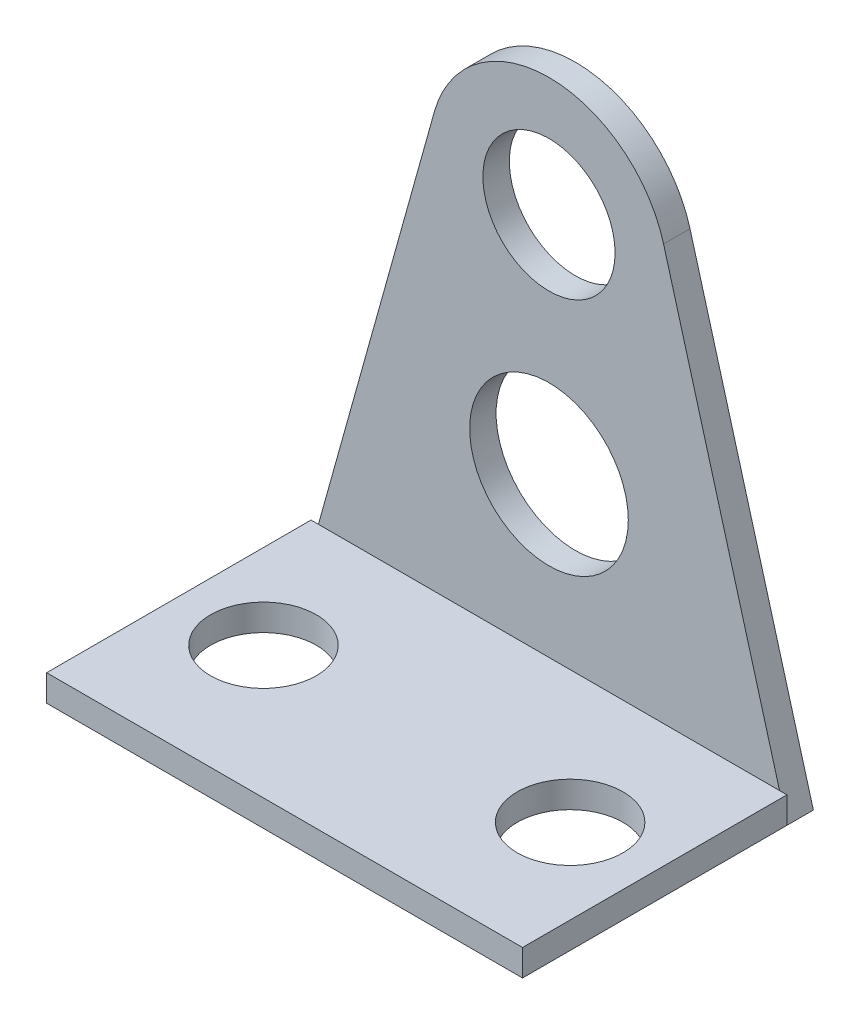
ISO-10303-21;
HEADER;
FILE_DESCRIPTION(('STEP AP214'),'2;1');
FILE_NAME('part.step','',(''),(''),'','','');
FILE_SCHEMA(('AUTOMOTIVE_DESIGN { 1 0 10303 214 1 1 1 1 }'));
ENDSEC;
DATA;
#1=APPLICATION_CONTEXT('core data for automotive mechanical design processes');
#2=APPLICATION_PROTOCOL_DEFINITION('international standard','automotive_design',2000,#1);
#3=PRODUCT_CONTEXT('',#1,'mechanical');
#4=PRODUCT('Part','Part','',(#3));
#5=PRODUCT_RELATED_PRODUCT_CATEGORY('part','',(#4));
#6=PRODUCT_DEFINITION_FORMATION('','',#4);
#7=PRODUCT_DEFINITION_CONTEXT('part definition',#1,'design');
#8=PRODUCT_DEFINITION('design','',#6,#7);
#9=PRODUCT_DEFINITION_SHAPE('','',#8);
#10=(LENGTH_UNIT() NAMED_UNIT(*) SI_UNIT(.MILLI.,.METRE.));
#11=(NAMED_UNIT(*) PLANE_ANGLE_UNIT() SI_UNIT($,.RADIAN.));
#12=(NAMED_UNIT(*) SI_UNIT($,.STERADIAN.) SOLID_ANGLE_UNIT());
#13=UNCERTAINTY_MEASURE_WITH_UNIT(LENGTH_MEASURE(1.E-05),#10,'distance_accuracy_value','');
#14=(GEOMETRIC_REPRESENTATION_CONTEXT(3) GLOBAL_UNCERTAINTY_ASSIGNED_CONTEXT((#13)) GLOBAL_UNIT_ASSIGNED_CONTEXT((#10,
#11,#12)) REPRESENTATION_CONTEXT('',''));
#15=CARTESIAN_POINT('',(0.,0.,0.));
#16=DIRECTION('',(0.,0.,1.));
#17=DIRECTION('',(1.,0.,0.));
#18=AXIS2_PLACEMENT_3D('',#15,#16,#17);
#19=CARTESIAN_POINT('',(4.5,7.75,0.5));
#20=DIRECTION('',(0.,0.,1.));
#21=DIRECTION('',(1.,0.,0.));
#22=AXIS2_PLACEMENT_3D('',#19,#20,#21);
#23=PLANE('',#22);
#24=DIRECTION('',(-1.,0.,0.));
#25=VECTOR('',#24,1.);
#26=CARTESIAN_POINT('',(0.,0.5,0.5));
#27=LINE('',#26,#25);
#28=CARTESIAN_POINT('',(8.86039109563191,0.5,0.5));
#29=VERTEX_POINT('',#28);
#30=CARTESIAN_POINT('',(0.139608904368094,0.5,0.5));
#31=VERTEX_POINT('',#30);
#32=EDGE_CURVE('E11',#29,#31,#27,.T.);
#33=ORIENTED_EDGE('',*,*,#32,.F.);
#34=DIRECTION('',(-0.268931250291291,0.963159375501668,0.));
#35=VECTOR('',#34,1.);
#36=CARTESIAN_POINT('',(9.,0.,0.5));
#37=LINE('',#36,#35);
#38=CARTESIAN_POINT('',(6.66710859487875,8.3550953131554,0.5));
#39=VERTEX_POINT('',#38);
#40=EDGE_CURVE('E155',#29,#39,#37,.T.);
#41=ORIENTED_EDGE('',*,*,#40,.T.);
#42=CARTESIAN_POINT('',(4.5,7.75,0.5));
#43=DIRECTION('',(0.,0.,1.));
#44=DIRECTION('',(1.,0.,0.));
#45=AXIS2_PLACEMENT_3D('',#42,#43,#44);
#46=CIRCLE('',#45,2.25);
#47=CARTESIAN_POINT('',(2.33289140512125,8.3550953131554,0.5));
#48=VERTEX_POINT('',#47);
#49=EDGE_CURVE('E58',#39,#48,#46,.T.);
#50=ORIENTED_EDGE('',*,*,#49,.T.);
#51=DIRECTION('',(-0.268931250291291,-0.963159375501668,0.));
#52=VECTOR('',#51,1.);
#53=CARTESIAN_POINT('',(0.,0.,0.5));
#54=LINE('',#53,#52);
#55=EDGE_CURVE('E153',#48,#31,#54,.T.);
#56=ORIENTED_EDGE('',*,*,#55,.T.);
#57=EDGE_LOOP('',(#33,#41,#50,#56));
#58=FACE_BOUND('',#57,.T.);
#59=CARTESIAN_POINT('',(4.5,7.75,0.5));
#60=DIRECTION('',(0.,0.,1.));
#61=DIRECTION('',(1.,0.,0.));
#62=AXIS2_PLACEMENT_3D('',#59,#60,#61);
#63=CIRCLE('',#62,1.25);
#64=CARTESIAN_POINT('',(5.75,7.75,0.5));
#65=VERTEX_POINT('',#64);
#66=EDGE_CURVE('E147',#65,#65,#63,.T.);
#67=ORIENTED_EDGE('',*,*,#66,.F.);
#68=EDGE_LOOP('',(#67));
#69=FACE_BOUND('',#68,.T.);
#70=CARTESIAN_POINT('',(4.5,3.5,0.5));
#71=DIRECTION('',(0.,0.,1.));
#72=DIRECTION('',(1.,0.,0.));
#73=AXIS2_PLACEMENT_3D('',#70,#71,#72);
#74=CIRCLE('',#73,1.5);
#75=CARTESIAN_POINT('',(6.,3.5,0.5));
#76=VERTEX_POINT('',#75);
#77=EDGE_CURVE('E138',#76,#76,#74,.T.);
#78=ORIENTED_EDGE('',*,*,#77,.F.);
#79=EDGE_LOOP('',(#78));
#80=FACE_BOUND('',#79,.T.);
#81=ADVANCED_FACE('F36',(#58,#69,#80),#23,.T.);
#82=CARTESIAN_POINT('',(4.5,7.75,0.));
#83=DIRECTION('',(0.,0.,1.));
#84=DIRECTION('',(1.,0.,0.));
#85=AXIS2_PLACEMENT_3D('',#82,#83,#84);
#86=PLANE('',#85);
#87=CARTESIAN_POINT('',(4.5,7.75,0.));
#88=DIRECTION('',(0.,0.,1.));
#89=DIRECTION('',(1.,0.,0.));
#90=AXIS2_PLACEMENT_3D('',#87,#88,#89);
#91=CIRCLE('',#90,1.25);
#92=CARTESIAN_POINT('',(5.75,7.75,0.));
#93=VERTEX_POINT('',#92);
#94=EDGE_CURVE('E145',#93,#93,#91,.T.);
#95=ORIENTED_EDGE('',*,*,#94,.T.);
#96=EDGE_LOOP('',(#95));
#97=FACE_BOUND('',#96,.T.);
#98=DIRECTION('',(-0.268931250291291,-0.963159375501668,0.));
#99=VECTOR('',#98,1.);
#100=CARTESIAN_POINT('',(0.,0.,0.));
#101=LINE('',#100,#99);
#102=CARTESIAN_POINT('',(2.33289140512125,8.3550953131554,0.));
#103=VERTEX_POINT('',#102);
#104=CARTESIAN_POINT('',(0.,0.,0.));
#105=VERTEX_POINT('',#104);
#106=EDGE_CURVE('E150',#103,#105,#101,.T.);
#107=ORIENTED_EDGE('',*,*,#106,.F.);
#108=CARTESIAN_POINT('',(4.5,7.75,0.));
#109=DIRECTION('',(0.,0.,1.));
#110=DIRECTION('',(1.,0.,0.));
#111=AXIS2_PLACEMENT_3D('',#108,#109,#110);
#112=CIRCLE('',#111,2.25);
#113=CARTESIAN_POINT('',(6.66710859487875,8.3550953131554,0.));
#114=VERTEX_POINT('',#113);
#115=EDGE_CURVE('E79',#114,#103,#112,.T.);
#116=ORIENTED_EDGE('',*,*,#115,.F.);
#117=DIRECTION('',(-0.268931250291291,0.963159375501668,0.));
#118=VECTOR('',#117,1.);
#119=CARTESIAN_POINT('',(9.,0.,0.));
#120=LINE('',#119,#118);
#121=CARTESIAN_POINT('',(9.,0.,0.));
#122=VERTEX_POINT('',#121);
#123=EDGE_CURVE('E165',#122,#114,#120,.T.);
#124=ORIENTED_EDGE('',*,*,#123,.F.);
#125=DIRECTION('',(1.,0.,0.));
#126=VECTOR('',#125,1.);
#127=CARTESIAN_POINT('',(0.,0.,0.));
#128=LINE('',#127,#126);
#129=EDGE_CURVE('E163',#105,#122,#128,.T.);
#130=ORIENTED_EDGE('',*,*,#129,.F.);
#131=EDGE_LOOP('',(#107,#116,#124,#130));
#132=FACE_BOUND('',#131,.T.);
#133=CARTESIAN_POINT('',(4.5,3.5,0.));
#134=DIRECTION('',(0.,0.,1.));
#135=DIRECTION('',(1.,0.,0.));
#136=AXIS2_PLACEMENT_3D('',#133,#134,#135);
#137=CIRCLE('',#136,1.5);
#138=CARTESIAN_POINT('',(6.,3.5,0.));
#139=VERTEX_POINT('',#138);
#140=EDGE_CURVE('E135',#139,#139,#137,.T.);
#141=ORIENTED_EDGE('',*,*,#140,.T.);
#142=EDGE_LOOP('',(#141));
#143=FACE_BOUND('',#142,.T.);
#144=ADVANCED_FACE('F178',(#97,#132,#143),#86,.F.);
#145=CARTESIAN_POINT('',(0.,0.,0.5));
#146=DIRECTION('',(0.963159375501668,-0.268931250291291,0.));
#147=DIRECTION('',(0.268931250291291,0.963159375501668,0.));
#148=AXIS2_PLACEMENT_3D('',#145,#146,#147);
#149=PLANE('',#148);
#150=ORIENTED_EDGE('',*,*,#106,.T.);
#151=DIRECTION('',(0.,0.,-1.));
#152=VECTOR('',#151,1.);
#153=CARTESIAN_POINT('',(0.,0.,0.5));
#154=LINE('',#153,#152);
#155=CARTESIAN_POINT('',(0.,0.,0.5));
#156=VERTEX_POINT('',#155);
#157=EDGE_CURVE('E40',#156,#105,#154,.T.);
#158=ORIENTED_EDGE('',*,*,#157,.F.);
#159=EDGE_CURVE('E156',#31,#156,#54,.T.);
#160=ORIENTED_EDGE('',*,*,#159,.F.);
#161=ORIENTED_EDGE('',*,*,#55,.F.);
#162=DIRECTION('',(0.,0.,-1.));
#163=VECTOR('',#162,1.);
#164=CARTESIAN_POINT('',(2.33289140512125,8.3550953131554,0.5));
#165=LINE('',#164,#163);
#166=EDGE_CURVE('E161',#48,#103,#165,.T.);
#167=ORIENTED_EDGE('',*,*,#166,.T.);
#168=EDGE_LOOP('',(#150,#158,#160,#161,#167));
#169=FACE_BOUND('',#168,.T.);
#170=ADVANCED_FACE('F38',(#169),#149,.F.);
#171=CARTESIAN_POINT('',(0.,0.,0.5));
#172=DIRECTION('',(0.,1.,0.));
#173=DIRECTION('',(0.,0.,1.));
#174=AXIS2_PLACEMENT_3D('',#171,#172,#173);
#175=PLANE('',#174);
#176=CARTESIAN_POINT('',(7.4,0.,3.));
#177=DIRECTION('',(0.,1.,0.));
#178=DIRECTION('',(0.,0.,1.));
#179=AXIS2_PLACEMENT_3D('',#176,#177,#178);
#180=CIRCLE('',#179,1.);
#181=CARTESIAN_POINT('',(7.4,0.,4.));
#182=VERTEX_POINT('',#181);
#183=EDGE_CURVE('E216',#182,#182,#180,.F.);
#184=ORIENTED_EDGE('',*,*,#183,.F.);
#185=EDGE_LOOP('',(#184));
#186=FACE_BOUND('',#185,.T.);
#187=CARTESIAN_POINT('',(1.6,0.,3.));
#188=DIRECTION('',(0.,1.,0.));
#189=DIRECTION('',(0.,0.,1.));
#190=AXIS2_PLACEMENT_3D('',#187,#188,#189);
#191=CIRCLE('',#190,1.);
#192=CARTESIAN_POINT('',(1.6,0.,4.));
#193=VERTEX_POINT('',#192);
#194=EDGE_CURVE('E219',#193,#193,#191,.F.);
#195=ORIENTED_EDGE('',*,*,#194,.F.);
#196=EDGE_LOOP('',(#195));
#197=FACE_BOUND('',#196,.T.);
#198=ORIENTED_EDGE('',*,*,#129,.T.);
#199=DIRECTION('',(0.,0.,-1.));
#200=VECTOR('',#199,1.);
#201=CARTESIAN_POINT('',(9.,0.,0.5));
#202=LINE('',#201,#200);
#203=CARTESIAN_POINT('',(9.,0.,0.5));
#204=VERTEX_POINT('',#203);
#205=EDGE_CURVE('E170',#204,#122,#202,.T.);
#206=ORIENTED_EDGE('',*,*,#205,.F.);
#207=DIRECTION('',(0.,0.,-1.));
#208=VECTOR('',#207,1.);
#209=CARTESIAN_POINT('',(9.,0.,5.5));
#210=LINE('',#209,#208);
#211=CARTESIAN_POINT('',(9.,0.,5.5));
#212=VERTEX_POINT('',#211);
#213=EDGE_CURVE('E118',#212,#204,#210,.T.);
#214=ORIENTED_EDGE('',*,*,#213,.F.);
#215=DIRECTION('',(1.,0.,0.));
#216=VECTOR('',#215,1.);
#217=CARTESIAN_POINT('',(0.,0.,5.5));
#218=LINE('',#217,#216);
#219=CARTESIAN_POINT('',(0.,0.,5.5));
#220=VERTEX_POINT('',#219);
#221=EDGE_CURVE('E111',#220,#212,#218,.T.);
#222=ORIENTED_EDGE('',*,*,#221,.F.);
#223=DIRECTION('',(0.,0.,-1.));
#224=VECTOR('',#223,1.);
#225=CARTESIAN_POINT('',(0.,0.,5.5));
#226=LINE('',#225,#224);
#227=EDGE_CURVE('E115',#220,#156,#226,.T.);
#228=ORIENTED_EDGE('',*,*,#227,.T.);
#229=ORIENTED_EDGE('',*,*,#157,.T.);
#230=EDGE_LOOP('',(#198,#206,#214,#222,#228,#229));
#231=FACE_BOUND('',#230,.T.);
#232=ADVANCED_FACE('F113',(#186,#197,#231),#175,.F.);
#233=CARTESIAN_POINT('',(9.,0.,0.5));
#234=DIRECTION('',(-0.963159375501668,-0.268931250291291,0.));
#235=DIRECTION('',(0.268931250291291,-0.963159375501668,0.));
#236=AXIS2_PLACEMENT_3D('',#233,#234,#235);
#237=PLANE('',#236);
#238=ORIENTED_EDGE('',*,*,#123,.T.);
#239=DIRECTION('',(0.,0.,-1.));
#240=VECTOR('',#239,1.);
#241=CARTESIAN_POINT('',(6.66710859487875,8.3550953131554,0.5));
#242=LINE('',#241,#240);
#243=EDGE_CURVE('E169',#39,#114,#242,.T.);
#244=ORIENTED_EDGE('',*,*,#243,.F.);
#245=ORIENTED_EDGE('',*,*,#40,.F.);
#246=EDGE_CURVE('E157',#204,#29,#37,.T.);
#247=ORIENTED_EDGE('',*,*,#246,.F.);
#248=ORIENTED_EDGE('',*,*,#205,.T.);
#249=EDGE_LOOP('',(#238,#244,#245,#247,#248));
#250=FACE_BOUND('',#249,.T.);
#251=ADVANCED_FACE('F181',(#250),#237,.F.);
#252=CARTESIAN_POINT('',(4.5,7.75,0.5));
#253=DIRECTION('',(0.,0.,-1.));
#254=DIRECTION('',(-1.,0.,0.));
#255=AXIS2_PLACEMENT_3D('',#252,#253,#254);
#256=CYLINDRICAL_SURFACE('',#255,2.25);
#257=ORIENTED_EDGE('',*,*,#115,.T.);
#258=ORIENTED_EDGE('',*,*,#166,.F.);
#259=ORIENTED_EDGE('',*,*,#49,.F.);
#260=ORIENTED_EDGE('',*,*,#243,.T.);
#261=EDGE_LOOP('',(#257,#258,#259,#260));
#262=FACE_BOUND('',#261,.T.);
#263=ADVANCED_FACE('F182',(#262),#256,.T.);
#264=CARTESIAN_POINT('',(4.5,7.75,0.5));
#265=DIRECTION('',(0.,0.,-1.));
#266=DIRECTION('',(-1.,0.,0.));
#267=AXIS2_PLACEMENT_3D('',#264,#265,#266);
#268=CYLINDRICAL_SURFACE('',#267,1.25);
#269=ORIENTED_EDGE('',*,*,#66,.T.);
#270=EDGE_LOOP('',(#269));
#271=FACE_BOUND('',#270,.T.);
#272=ORIENTED_EDGE('',*,*,#94,.F.);
#273=EDGE_LOOP('',(#272));
#274=FACE_BOUND('',#273,.T.);
#275=ADVANCED_FACE('F195',(#271,#274),#268,.F.);
#276=CARTESIAN_POINT('',(4.5,3.5,0.5));
#277=DIRECTION('',(0.,0.,-1.));
#278=DIRECTION('',(-1.,0.,0.));
#279=AXIS2_PLACEMENT_3D('',#276,#277,#278);
#280=CYLINDRICAL_SURFACE('',#279,1.5);
#281=ORIENTED_EDGE('',*,*,#77,.T.);
#282=EDGE_LOOP('',(#281));
#283=FACE_BOUND('',#282,.T.);
#284=ORIENTED_EDGE('',*,*,#140,.F.);
#285=EDGE_LOOP('',(#284));
#286=FACE_BOUND('',#285,.T.);
#287=ADVANCED_FACE('F191',(#283,#286),#280,.F.);
#288=CARTESIAN_POINT('',(0.,0.,0.5));
#289=DIRECTION('',(0.,0.,-1.));
#290=DIRECTION('',(-1.,0.,0.));
#291=AXIS2_PLACEMENT_3D('',#288,#289,#290);
#292=PLANE('',#291);
#293=CARTESIAN_POINT('',(0.,0.5,0.5));
#294=VERTEX_POINT('',#293);
#295=EDGE_CURVE('E47',#31,#294,#27,.T.);
#296=ORIENTED_EDGE('',*,*,#295,.F.);
#297=ORIENTED_EDGE('',*,*,#159,.T.);
#298=DIRECTION('',(0.,-1.,0.));
#299=VECTOR('',#298,1.);
#300=CARTESIAN_POINT('',(0.,0.,0.5));
#301=LINE('',#300,#299);
#302=EDGE_CURVE('E134',#294,#156,#301,.T.);
#303=ORIENTED_EDGE('',*,*,#302,.F.);
#304=EDGE_LOOP('',(#296,#297,#303));
#305=FACE_BOUND('',#304,.T.);
#306=ADVANCED_FACE('F194',(#305),#292,.T.);
#307=CARTESIAN_POINT('',(0.,0.,5.5));
#308=DIRECTION('',(1.,0.,0.));
#309=DIRECTION('',(0.,0.,-1.));
#310=AXIS2_PLACEMENT_3D('',#307,#308,#309);
#311=PLANE('',#310);
#312=ORIENTED_EDGE('',*,*,#302,.T.);
#313=ORIENTED_EDGE('',*,*,#227,.F.);
#314=DIRECTION('',(0.,-1.,0.));
#315=VECTOR('',#314,1.);
#316=CARTESIAN_POINT('',(0.,0.,5.5));
#317=LINE('',#316,#315);
#318=CARTESIAN_POINT('',(0.,0.5,5.5));
#319=VERTEX_POINT('',#318);
#320=EDGE_CURVE('E122',#319,#220,#317,.T.);
#321=ORIENTED_EDGE('',*,*,#320,.F.);
#322=DIRECTION('',(0.,0.,-1.));
#323=VECTOR('',#322,1.);
#324=CARTESIAN_POINT('',(0.,0.5,5.5));
#325=LINE('',#324,#323);
#326=EDGE_CURVE('E230',#319,#294,#325,.T.);
#327=ORIENTED_EDGE('',*,*,#326,.T.);
#328=EDGE_LOOP('',(#312,#313,#321,#327));
#329=FACE_BOUND('',#328,.T.);
#330=ADVANCED_FACE('F132',(#329),#311,.F.);
#331=CARTESIAN_POINT('',(9.,0.,5.5));
#332=DIRECTION('',(-1.,0.,0.));
#333=DIRECTION('',(0.,0.,1.));
#334=AXIS2_PLACEMENT_3D('',#331,#332,#333);
#335=PLANE('',#334);
#336=DIRECTION('',(0.,1.,0.));
#337=VECTOR('',#336,1.);
#338=CARTESIAN_POINT('',(9.,0.,0.5));
#339=LINE('',#338,#337);
#340=CARTESIAN_POINT('',(9.,0.5,0.5));
#341=VERTEX_POINT('',#340);
#342=EDGE_CURVE('E223',#204,#341,#339,.T.);
#343=ORIENTED_EDGE('',*,*,#342,.T.);
#344=DIRECTION('',(0.,0.,-1.));
#345=VECTOR('',#344,1.);
#346=CARTESIAN_POINT('',(9.,0.5,5.5));
#347=LINE('',#346,#345);
#348=CARTESIAN_POINT('',(9.,0.5,5.5));
#349=VERTEX_POINT('',#348);
#350=EDGE_CURVE('E140',#349,#341,#347,.T.);
#351=ORIENTED_EDGE('',*,*,#350,.F.);
#352=DIRECTION('',(0.,1.,0.));
#353=VECTOR('',#352,1.);
#354=CARTESIAN_POINT('',(9.,0.,5.5));
#355=LINE('',#354,#353);
#356=EDGE_CURVE('E121',#212,#349,#355,.T.);
#357=ORIENTED_EDGE('',*,*,#356,.F.);
#358=ORIENTED_EDGE('',*,*,#213,.T.);
#359=EDGE_LOOP('',(#343,#351,#357,#358));
#360=FACE_BOUND('',#359,.T.);
#361=ADVANCED_FACE('F243',(#360),#335,.F.);
#362=CARTESIAN_POINT('',(0.,0.5,5.5));
#363=DIRECTION('',(0.,-1.,0.));
#364=DIRECTION('',(0.,0.,-1.));
#365=AXIS2_PLACEMENT_3D('',#362,#363,#364);
#366=PLANE('',#365);
#367=CARTESIAN_POINT('',(7.4,0.5,3.));
#368=DIRECTION('',(0.,1.,0.));
#369=DIRECTION('',(0.,0.,1.));
#370=AXIS2_PLACEMENT_3D('',#367,#368,#369);
#371=CIRCLE('',#370,1.);
#372=CARTESIAN_POINT('',(7.4,0.5,4.));
#373=VERTEX_POINT('',#372);
#374=EDGE_CURVE('E335',#373,#373,#371,.T.);
#375=ORIENTED_EDGE('',*,*,#374,.F.);
#376=EDGE_LOOP('',(#375));
#377=FACE_BOUND('',#376,.T.);
#378=CARTESIAN_POINT('',(1.6,0.5,3.));
#379=DIRECTION('',(0.,1.,0.));
#380=DIRECTION('',(0.,0.,1.));
#381=AXIS2_PLACEMENT_3D('',#378,#379,#380);
#382=CIRCLE('',#381,1.);
#383=CARTESIAN_POINT('',(1.6,0.5,4.));
#384=VERTEX_POINT('',#383);
#385=EDGE_CURVE('E221',#384,#384,#382,.T.);
#386=ORIENTED_EDGE('',*,*,#385,.F.);
#387=EDGE_LOOP('',(#386));
#388=FACE_BOUND('',#387,.T.);
#389=EDGE_CURVE('E46',#341,#29,#27,.T.);
#390=ORIENTED_EDGE('',*,*,#389,.T.);
#391=ORIENTED_EDGE('',*,*,#32,.T.);
#392=ORIENTED_EDGE('',*,*,#295,.T.);
#393=ORIENTED_EDGE('',*,*,#326,.F.);
#394=DIRECTION('',(-1.,0.,0.));
#395=VECTOR('',#394,1.);
#396=CARTESIAN_POINT('',(0.,0.5,5.5));
#397=LINE('',#396,#395);
#398=EDGE_CURVE('E127',#349,#319,#397,.T.);
#399=ORIENTED_EDGE('',*,*,#398,.F.);
#400=ORIENTED_EDGE('',*,*,#350,.T.);
#401=EDGE_LOOP('',(#390,#391,#392,#393,#399,#400));
#402=FACE_BOUND('',#401,.T.);
#403=ADVANCED_FACE('F238',(#377,#388,#402),#366,.F.);
#404=CARTESIAN_POINT('',(0.,0.,5.5));
#405=DIRECTION('',(0.,0.,-1.));
#406=DIRECTION('',(-1.,0.,0.));
#407=AXIS2_PLACEMENT_3D('',#404,#405,#406);
#408=PLANE('',#407);
#409=ORIENTED_EDGE('',*,*,#320,.T.);
#410=ORIENTED_EDGE('',*,*,#221,.T.);
#411=ORIENTED_EDGE('',*,*,#356,.T.);
#412=ORIENTED_EDGE('',*,*,#398,.T.);
#413=EDGE_LOOP('',(#409,#410,#411,#412));
#414=FACE_BOUND('',#413,.T.);
#415=ADVANCED_FACE('F125',(#414),#408,.F.);
#416=ORIENTED_EDGE('',*,*,#342,.F.);
#417=ORIENTED_EDGE('',*,*,#246,.T.);
#418=ORIENTED_EDGE('',*,*,#389,.F.);
#419=EDGE_LOOP('',(#416,#417,#418));
#420=FACE_BOUND('',#419,.T.);
#421=ADVANCED_FACE('F242',(#420),#292,.T.);
#422=CARTESIAN_POINT('',(1.6,-0.00100000000000002,3.));
#423=DIRECTION('',(0.,1.,0.));
#424=DIRECTION('',(0.,0.,1.));
#425=AXIS2_PLACEMENT_3D('',#422,#423,#424);
#426=CYLINDRICAL_SURFACE('',#425,1.);
#427=ORIENTED_EDGE('',*,*,#385,.T.);
#428=EDGE_LOOP('',(#427));
#429=FACE_BOUND('',#428,.T.);
#430=ORIENTED_EDGE('',*,*,#194,.T.);
#431=EDGE_LOOP('',(#430));
#432=FACE_BOUND('',#431,.T.);
#433=ADVANCED_FACE('F299',(#429,#432),#426,.F.);
#434=CARTESIAN_POINT('',(7.4,-0.00100000000000002,3.));
#435=DIRECTION('',(0.,1.,0.));
#436=DIRECTION('',(0.,0.,1.));
#437=AXIS2_PLACEMENT_3D('',#434,#435,#436);
#438=CYLINDRICAL_SURFACE('',#437,1.);
#439=ORIENTED_EDGE('',*,*,#374,.T.);
#440=EDGE_LOOP('',(#439));
#441=FACE_BOUND('',#440,.T.);
#442=ORIENTED_EDGE('',*,*,#183,.T.);
#443=EDGE_LOOP('',(#442));
#444=FACE_BOUND('',#443,.T.);
#445=ADVANCED_FACE('F318',(#441,#444),#438,.F.);
#446=CLOSED_SHELL('',(#81,#144,#170,#232,#251,#263,#275,#287,#306,#330,#361,#403,#415,#421,#433,#445));
#447=MANIFOLD_SOLID_BREP('B2',#446);
#448=ADVANCED_BREP_SHAPE_REPRESENTATION('',(#18,#447),#14);
#449=SHAPE_DEFINITION_REPRESENTATION(#9,#448);
ENDSEC;
END-ISO-10303-21;
